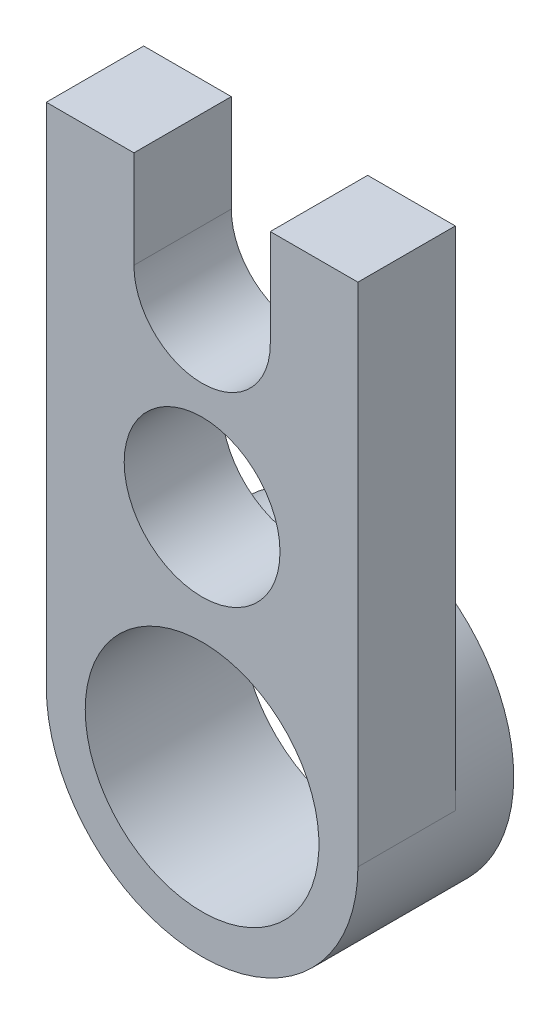
ISO-10303-21;
HEADER;
FILE_DESCRIPTION(('STEP AP214'),'2;1');
FILE_NAME('part.step','',(''),(''),'','','');
FILE_SCHEMA(('AUTOMOTIVE_DESIGN { 1 0 10303 214 1 1 1 1 }'));
ENDSEC;
DATA;
#1=APPLICATION_CONTEXT('core data for automotive mechanical design processes');
#2=APPLICATION_PROTOCOL_DEFINITION('international standard','automotive_design',2000,#1);
#3=PRODUCT_CONTEXT('',#1,'mechanical');
#4=PRODUCT('Part','Part','',(#3));
#5=PRODUCT_RELATED_PRODUCT_CATEGORY('part','',(#4));
#6=PRODUCT_DEFINITION_FORMATION('','',#4);
#7=PRODUCT_DEFINITION_CONTEXT('part definition',#1,'design');
#8=PRODUCT_DEFINITION('design','',#6,#7);
#9=PRODUCT_DEFINITION_SHAPE('','',#8);
#10=(LENGTH_UNIT() NAMED_UNIT(*) SI_UNIT(.MILLI.,.METRE.));
#11=(NAMED_UNIT(*) PLANE_ANGLE_UNIT() SI_UNIT($,.RADIAN.));
#12=(NAMED_UNIT(*) SI_UNIT($,.STERADIAN.) SOLID_ANGLE_UNIT());
#13=UNCERTAINTY_MEASURE_WITH_UNIT(LENGTH_MEASURE(1.E-05),#10,'distance_accuracy_value','');
#14=(GEOMETRIC_REPRESENTATION_CONTEXT(3) GLOBAL_UNCERTAINTY_ASSIGNED_CONTEXT((#13)) GLOBAL_UNIT_ASSIGNED_CONTEXT((#10,
#11,#12)) REPRESENTATION_CONTEXT('',''));
#15=CARTESIAN_POINT('',(0.,0.,0.));
#16=DIRECTION('',(0.,0.,1.));
#17=DIRECTION('',(1.,0.,0.));
#18=AXIS2_PLACEMENT_3D('',#15,#16,#17);
#19=CARTESIAN_POINT('',(-22.2428015564203,0.,-3.));
#20=DIRECTION('',(0.,0.,1.));
#21=DIRECTION('',(1.,0.,0.));
#22=AXIS2_PLACEMENT_3D('',#19,#20,#21);
#23=PLANE('',#22);
#24=CARTESIAN_POINT('',(-22.2428015564203,0.,-3.));
#25=DIRECTION('',(0.,0.,1.));
#26=DIRECTION('',(1.,0.,0.));
#27=AXIS2_PLACEMENT_3D('',#24,#25,#26);
#28=CIRCLE('',#27,7.99999999999999);
#29=CARTESIAN_POINT('',(-14.2428015564203,0.,-3.));
#30=VERTEX_POINT('',#29);
#31=EDGE_CURVE('E121',#30,#30,#28,.T.);
#32=ORIENTED_EDGE('',*,*,#31,.F.);
#33=EDGE_LOOP('',(#32));
#34=FACE_BOUND('',#33,.T.);
#35=CARTESIAN_POINT('',(-22.2428015564203,0.,-3.));
#36=DIRECTION('',(0.,0.,-1.));
#37=DIRECTION('',(-1.,0.,0.));
#38=AXIS2_PLACEMENT_3D('',#35,#36,#37);
#39=CIRCLE('',#38,6.);
#40=CARTESIAN_POINT('',(-28.2428015564203,0.,-3.));
#41=VERTEX_POINT('',#40);
#42=EDGE_CURVE('E310',#41,#41,#39,.T.);
#43=ORIENTED_EDGE('',*,*,#42,.F.);
#44=EDGE_LOOP('',(#43));
#45=FACE_BOUND('',#44,.T.);
#46=ADVANCED_FACE('F30',(#34,#45),#23,.F.);
#47=CARTESIAN_POINT('',(-22.2428015564203,0.,5.));
#48=DIRECTION('',(0.,0.,-1.));
#49=DIRECTION('',(-1.,0.,0.));
#50=AXIS2_PLACEMENT_3D('',#47,#48,#49);
#51=PLANE('',#50);
#52=DIRECTION('',(0.,1.,0.));
#53=VECTOR('',#52,1.);
#54=CARTESIAN_POINT('',(-30.2428015564203,0.,5.));
#55=LINE('',#54,#53);
#56=CARTESIAN_POINT('',(-30.2428015564203,0.,5.));
#57=VERTEX_POINT('',#56);
#58=CARTESIAN_POINT('',(-30.2428015564203,26.,5.));
#59=VERTEX_POINT('',#58);
#60=EDGE_CURVE('E142',#57,#59,#55,.T.);
#61=ORIENTED_EDGE('',*,*,#60,.F.);
#62=CARTESIAN_POINT('',(-22.2428015564203,0.,5.));
#63=DIRECTION('',(0.,0.,-1.));
#64=DIRECTION('',(-1.,0.,0.));
#65=AXIS2_PLACEMENT_3D('',#62,#63,#64);
#66=CIRCLE('',#65,7.99999999999999);
#67=CARTESIAN_POINT('',(-14.2428015564203,0.,5.));
#68=VERTEX_POINT('',#67);
#69=EDGE_CURVE('E114',#68,#57,#66,.T.);
#70=ORIENTED_EDGE('',*,*,#69,.F.);
#71=DIRECTION('',(0.,-1.,0.));
#72=VECTOR('',#71,1.);
#73=CARTESIAN_POINT('',(-14.2428015564203,26.,5.));
#74=LINE('',#73,#72);
#75=CARTESIAN_POINT('',(-14.2428015564203,26.,5.));
#76=VERTEX_POINT('',#75);
#77=EDGE_CURVE('E115',#76,#68,#74,.T.);
#78=ORIENTED_EDGE('',*,*,#77,.F.);
#79=DIRECTION('',(-1.,0.,0.));
#80=VECTOR('',#79,1.);
#81=CARTESIAN_POINT('',(-14.2428015564203,26.,5.));
#82=LINE('',#81,#80);
#83=CARTESIAN_POINT('',(-18.7428015564203,26.,5.));
#84=VERTEX_POINT('',#83);
#85=EDGE_CURVE('E154',#76,#84,#82,.T.);
#86=ORIENTED_EDGE('',*,*,#85,.T.);
#87=DIRECTION('',(0.,1.,0.));
#88=VECTOR('',#87,1.);
#89=CARTESIAN_POINT('',(-18.7428015564203,21.,5.));
#90=LINE('',#89,#88);
#91=CARTESIAN_POINT('',(-18.7428015564203,21.,5.));
#92=VERTEX_POINT('',#91);
#93=EDGE_CURVE('E151',#92,#84,#90,.T.);
#94=ORIENTED_EDGE('',*,*,#93,.F.);
#95=CARTESIAN_POINT('',(-22.2428015564203,21.,5.));
#96=DIRECTION('',(0.,0.,1.));
#97=DIRECTION('',(1.,0.,0.));
#98=AXIS2_PLACEMENT_3D('',#95,#96,#97);
#99=CIRCLE('',#98,3.5);
#100=CARTESIAN_POINT('',(-25.7428015564203,21.,5.));
#101=VERTEX_POINT('',#100);
#102=EDGE_CURVE('E148',#101,#92,#99,.T.);
#103=ORIENTED_EDGE('',*,*,#102,.F.);
#104=DIRECTION('',(0.,1.,0.));
#105=VECTOR('',#104,1.);
#106=CARTESIAN_POINT('',(-25.7428015564203,21.,5.));
#107=LINE('',#106,#105);
#108=CARTESIAN_POINT('',(-25.7428015564203,26.,5.));
#109=VERTEX_POINT('',#108);
#110=EDGE_CURVE('E146',#101,#109,#107,.T.);
#111=ORIENTED_EDGE('',*,*,#110,.T.);
#112=DIRECTION('',(-1.,0.,0.));
#113=VECTOR('',#112,1.);
#114=CARTESIAN_POINT('',(-25.7428015564203,26.,5.));
#115=LINE('',#114,#113);
#116=EDGE_CURVE('E144',#109,#59,#115,.T.);
#117=ORIENTED_EDGE('',*,*,#116,.T.);
#118=EDGE_LOOP('',(#61,#70,#78,#86,#94,#103,#111,#117));
#119=FACE_BOUND('',#118,.T.);
#120=CARTESIAN_POINT('',(-22.2428015564203,12.,5.));
#121=DIRECTION('',(0.,0.,1.));
#122=DIRECTION('',(1.,0.,0.));
#123=AXIS2_PLACEMENT_3D('',#120,#121,#122);
#124=CIRCLE('',#123,4.);
#125=CARTESIAN_POINT('',(-18.2428015564203,12.,5.));
#126=VERTEX_POINT('',#125);
#127=EDGE_CURVE('E109',#126,#126,#124,.T.);
#128=ORIENTED_EDGE('',*,*,#127,.F.);
#129=EDGE_LOOP('',(#128));
#130=FACE_BOUND('',#129,.T.);
#131=CARTESIAN_POINT('',(-22.2428015564203,0.,5.00000000000001));
#132=DIRECTION('',(0.,0.,-1.));
#133=DIRECTION('',(-1.,0.,0.));
#134=AXIS2_PLACEMENT_3D('',#131,#132,#133);
#135=CIRCLE('',#134,6.);
#136=CARTESIAN_POINT('',(-28.2428015564203,0.,5.00000000000001));
#137=VERTEX_POINT('',#136);
#138=EDGE_CURVE('E313',#137,#137,#135,.T.);
#139=ORIENTED_EDGE('',*,*,#138,.T.);
#140=EDGE_LOOP('',(#139));
#141=FACE_BOUND('',#140,.T.);
#142=ADVANCED_FACE('F191',(#119,#130,#141),#51,.F.);
#143=CARTESIAN_POINT('',(-22.2428015564203,0.,0.));
#144=DIRECTION('',(0.,0.,-1.));
#145=DIRECTION('',(-1.,0.,0.));
#146=AXIS2_PLACEMENT_3D('',#143,#144,#145);
#147=PLANE('',#146);
#148=CARTESIAN_POINT('',(-22.2428015564203,0.,0.));
#149=DIRECTION('',(0.,0.,-1.));
#150=DIRECTION('',(-1.,0.,0.));
#151=AXIS2_PLACEMENT_3D('',#148,#149,#150);
#152=CIRCLE('',#151,7.99999999999999);
#153=CARTESIAN_POINT('',(-30.2428015564203,0.,0.));
#154=VERTEX_POINT('',#153);
#155=CARTESIAN_POINT('',(-22.2428015564203,8.,0.));
#156=VERTEX_POINT('',#155);
#157=EDGE_CURVE('E113',#154,#156,#152,.T.);
#158=ORIENTED_EDGE('',*,*,#157,.F.);
#159=DIRECTION('',(0.,1.,0.));
#160=VECTOR('',#159,1.);
#161=CARTESIAN_POINT('',(-30.2428015564203,0.,0.));
#162=LINE('',#161,#160);
#163=CARTESIAN_POINT('',(-30.2428015564203,26.,0.));
#164=VERTEX_POINT('',#163);
#165=EDGE_CURVE('E98',#154,#164,#162,.T.);
#166=ORIENTED_EDGE('',*,*,#165,.T.);
#167=DIRECTION('',(-1.,0.,0.));
#168=VECTOR('',#167,1.);
#169=CARTESIAN_POINT('',(-25.7428015564203,26.,0.));
#170=LINE('',#169,#168);
#171=CARTESIAN_POINT('',(-25.7428015564203,26.,0.));
#172=VERTEX_POINT('',#171);
#173=EDGE_CURVE('E108',#172,#164,#170,.T.);
#174=ORIENTED_EDGE('',*,*,#173,.F.);
#175=DIRECTION('',(0.,1.,0.));
#176=VECTOR('',#175,1.);
#177=CARTESIAN_POINT('',(-25.7428015564203,21.,0.));
#178=LINE('',#177,#176);
#179=CARTESIAN_POINT('',(-25.7428015564203,21.,0.));
#180=VERTEX_POINT('',#179);
#181=EDGE_CURVE('E128',#180,#172,#178,.T.);
#182=ORIENTED_EDGE('',*,*,#181,.F.);
#183=CARTESIAN_POINT('',(-22.2428015564203,21.,0.));
#184=DIRECTION('',(0.,0.,1.));
#185=DIRECTION('',(1.,0.,0.));
#186=AXIS2_PLACEMENT_3D('',#183,#184,#185);
#187=CIRCLE('',#186,3.5);
#188=CARTESIAN_POINT('',(-18.7428015564203,21.,0.));
#189=VERTEX_POINT('',#188);
#190=EDGE_CURVE('E130',#180,#189,#187,.T.);
#191=ORIENTED_EDGE('',*,*,#190,.T.);
#192=DIRECTION('',(0.,1.,0.));
#193=VECTOR('',#192,1.);
#194=CARTESIAN_POINT('',(-18.7428015564203,21.,0.));
#195=LINE('',#194,#193);
#196=CARTESIAN_POINT('',(-18.7428015564203,26.,0.));
#197=VERTEX_POINT('',#196);
#198=EDGE_CURVE('E133',#189,#197,#195,.T.);
#199=ORIENTED_EDGE('',*,*,#198,.T.);
#200=DIRECTION('',(-1.,0.,0.));
#201=VECTOR('',#200,1.);
#202=CARTESIAN_POINT('',(-14.2428015564203,26.,0.));
#203=LINE('',#202,#201);
#204=CARTESIAN_POINT('',(-14.2428015564203,26.,0.));
#205=VERTEX_POINT('',#204);
#206=EDGE_CURVE('E136',#205,#197,#203,.T.);
#207=ORIENTED_EDGE('',*,*,#206,.F.);
#208=DIRECTION('',(0.,-1.,0.));
#209=VECTOR('',#208,1.);
#210=CARTESIAN_POINT('',(-14.2428015564203,26.,0.));
#211=LINE('',#210,#209);
#212=CARTESIAN_POINT('',(-14.2428015564203,0.,0.));
#213=VERTEX_POINT('',#212);
#214=EDGE_CURVE('E139',#205,#213,#211,.T.);
#215=ORIENTED_EDGE('',*,*,#214,.T.);
#216=EDGE_CURVE('E47',#156,#213,#152,.T.);
#217=ORIENTED_EDGE('',*,*,#216,.F.);
#218=CARTESIAN_POINT('',(-22.2428015564203,12.,0.));
#219=DIRECTION('',(0.,0.,1.));
#220=DIRECTION('',(1.,0.,0.));
#221=AXIS2_PLACEMENT_3D('',#218,#219,#220);
#222=CIRCLE('',#221,4.);
#223=EDGE_CURVE('E118',#156,#156,#222,.T.);
#224=ORIENTED_EDGE('',*,*,#223,.T.);
#225=EDGE_LOOP('',(#158,#166,#174,#182,#191,#199,#207,#215,#217,#224));
#226=FACE_BOUND('',#225,.T.);
#227=ADVANCED_FACE('F116',(#226),#147,.T.);
#228=CARTESIAN_POINT('',(-22.2428015564203,0.,5.));
#229=DIRECTION('',(0.,0.,-1.));
#230=DIRECTION('',(-1.,0.,0.));
#231=AXIS2_PLACEMENT_3D('',#228,#229,#230);
#232=CYLINDRICAL_SURFACE('',#231,7.99999999999999);
#233=DIRECTION('',(0.,0.,-1.));
#234=VECTOR('',#233,1.);
#235=CARTESIAN_POINT('',(-30.2428015564203,0.,5.));
#236=LINE('',#235,#234);
#237=EDGE_CURVE('E34',#57,#154,#236,.T.);
#238=ORIENTED_EDGE('',*,*,#237,.T.);
#239=ORIENTED_EDGE('',*,*,#157,.T.);
#240=ORIENTED_EDGE('',*,*,#216,.T.);
#241=DIRECTION('',(0.,0.,-1.));
#242=VECTOR('',#241,1.);
#243=CARTESIAN_POINT('',(-14.2428015564203,0.,5.));
#244=LINE('',#243,#242);
#245=EDGE_CURVE('E11',#68,#213,#244,.T.);
#246=ORIENTED_EDGE('',*,*,#245,.F.);
#247=ORIENTED_EDGE('',*,*,#69,.T.);
#248=EDGE_LOOP('',(#238,#239,#240,#246,#247));
#249=FACE_BOUND('',#248,.T.);
#250=ORIENTED_EDGE('',*,*,#31,.T.);
#251=EDGE_LOOP('',(#250));
#252=FACE_BOUND('',#251,.T.);
#253=ADVANCED_FACE('F32',(#249,#252),#232,.T.);
#254=CARTESIAN_POINT('',(-14.2428015564203,26.,5.));
#255=DIRECTION('',(1.,0.,0.));
#256=DIRECTION('',(0.,1.,0.));
#257=AXIS2_PLACEMENT_3D('',#254,#255,#256);
#258=PLANE('',#257);
#259=ORIENTED_EDGE('',*,*,#214,.F.);
#260=DIRECTION('',(0.,0.,-1.));
#261=VECTOR('',#260,1.);
#262=CARTESIAN_POINT('',(-14.2428015564203,26.,5.));
#263=LINE('',#262,#261);
#264=EDGE_CURVE('E39',#76,#205,#263,.T.);
#265=ORIENTED_EDGE('',*,*,#264,.F.);
#266=ORIENTED_EDGE('',*,*,#77,.T.);
#267=ORIENTED_EDGE('',*,*,#245,.T.);
#268=EDGE_LOOP('',(#259,#265,#266,#267));
#269=FACE_BOUND('',#268,.T.);
#270=ADVANCED_FACE('F187',(#269),#258,.T.);
#271=CARTESIAN_POINT('',(-14.2428015564203,26.,5.));
#272=DIRECTION('',(0.,-1.,0.));
#273=DIRECTION('',(1.,0.,0.));
#274=AXIS2_PLACEMENT_3D('',#271,#272,#273);
#275=PLANE('',#274);
#276=ORIENTED_EDGE('',*,*,#206,.T.);
#277=DIRECTION('',(0.,0.,-1.));
#278=VECTOR('',#277,1.);
#279=CARTESIAN_POINT('',(-18.7428015564203,26.,5.));
#280=LINE('',#279,#278);
#281=EDGE_CURVE('E159',#84,#197,#280,.T.);
#282=ORIENTED_EDGE('',*,*,#281,.F.);
#283=ORIENTED_EDGE('',*,*,#85,.F.);
#284=ORIENTED_EDGE('',*,*,#264,.T.);
#285=EDGE_LOOP('',(#276,#282,#283,#284));
#286=FACE_BOUND('',#285,.T.);
#287=ADVANCED_FACE('F222',(#286),#275,.F.);
#288=CARTESIAN_POINT('',(-18.7428015564203,21.,5.));
#289=DIRECTION('',(-1.,0.,0.));
#290=DIRECTION('',(0.,-1.,0.));
#291=AXIS2_PLACEMENT_3D('',#288,#289,#290);
#292=PLANE('',#291);
#293=ORIENTED_EDGE('',*,*,#198,.F.);
#294=DIRECTION('',(0.,0.,-1.));
#295=VECTOR('',#294,1.);
#296=CARTESIAN_POINT('',(-18.7428015564203,21.,5.));
#297=LINE('',#296,#295);
#298=EDGE_CURVE('E161',#92,#189,#297,.T.);
#299=ORIENTED_EDGE('',*,*,#298,.F.);
#300=ORIENTED_EDGE('',*,*,#93,.T.);
#301=ORIENTED_EDGE('',*,*,#281,.T.);
#302=EDGE_LOOP('',(#293,#299,#300,#301));
#303=FACE_BOUND('',#302,.T.);
#304=ADVANCED_FACE('F181',(#303),#292,.T.);
#305=CARTESIAN_POINT('',(-22.2428015564203,21.,5.));
#306=DIRECTION('',(0.,0.,-1.));
#307=DIRECTION('',(-1.,0.,0.));
#308=AXIS2_PLACEMENT_3D('',#305,#306,#307);
#309=CYLINDRICAL_SURFACE('',#308,3.5);
#310=ORIENTED_EDGE('',*,*,#190,.F.);
#311=DIRECTION('',(0.,0.,-1.));
#312=VECTOR('',#311,1.);
#313=CARTESIAN_POINT('',(-25.7428015564203,21.,5.));
#314=LINE('',#313,#312);
#315=EDGE_CURVE('E163',#101,#180,#314,.T.);
#316=ORIENTED_EDGE('',*,*,#315,.F.);
#317=ORIENTED_EDGE('',*,*,#102,.T.);
#318=ORIENTED_EDGE('',*,*,#298,.T.);
#319=EDGE_LOOP('',(#310,#316,#317,#318));
#320=FACE_BOUND('',#319,.T.);
#321=ADVANCED_FACE('F176',(#320),#309,.F.);
#322=CARTESIAN_POINT('',(-25.7428015564203,21.,5.));
#323=DIRECTION('',(-1.,0.,0.));
#324=DIRECTION('',(0.,-1.,0.));
#325=AXIS2_PLACEMENT_3D('',#322,#323,#324);
#326=PLANE('',#325);
#327=ORIENTED_EDGE('',*,*,#181,.T.);
#328=DIRECTION('',(0.,0.,-1.));
#329=VECTOR('',#328,1.);
#330=CARTESIAN_POINT('',(-25.7428015564203,26.,5.));
#331=LINE('',#330,#329);
#332=EDGE_CURVE('E165',#109,#172,#331,.T.);
#333=ORIENTED_EDGE('',*,*,#332,.F.);
#334=ORIENTED_EDGE('',*,*,#110,.F.);
#335=ORIENTED_EDGE('',*,*,#315,.T.);
#336=EDGE_LOOP('',(#327,#333,#334,#335));
#337=FACE_BOUND('',#336,.T.);
#338=ADVANCED_FACE('F193',(#337),#326,.F.);
#339=CARTESIAN_POINT('',(-25.7428015564203,26.,5.));
#340=DIRECTION('',(0.,-1.,0.));
#341=DIRECTION('',(1.,0.,0.));
#342=AXIS2_PLACEMENT_3D('',#339,#340,#341);
#343=PLANE('',#342);
#344=ORIENTED_EDGE('',*,*,#173,.T.);
#345=DIRECTION('',(0.,0.,-1.));
#346=VECTOR('',#345,1.);
#347=CARTESIAN_POINT('',(-30.2428015564203,26.,5.));
#348=LINE('',#347,#346);
#349=EDGE_CURVE('E104',#59,#164,#348,.T.);
#350=ORIENTED_EDGE('',*,*,#349,.F.);
#351=ORIENTED_EDGE('',*,*,#116,.F.);
#352=ORIENTED_EDGE('',*,*,#332,.T.);
#353=EDGE_LOOP('',(#344,#350,#351,#352));
#354=FACE_BOUND('',#353,.T.);
#355=ADVANCED_FACE('F170',(#354),#343,.F.);
#356=CARTESIAN_POINT('',(-30.2428015564203,0.,5.));
#357=DIRECTION('',(-1.,0.,0.));
#358=DIRECTION('',(0.,-1.,0.));
#359=AXIS2_PLACEMENT_3D('',#356,#357,#358);
#360=PLANE('',#359);
#361=ORIENTED_EDGE('',*,*,#165,.F.);
#362=ORIENTED_EDGE('',*,*,#237,.F.);
#363=ORIENTED_EDGE('',*,*,#60,.T.);
#364=ORIENTED_EDGE('',*,*,#349,.T.);
#365=EDGE_LOOP('',(#361,#362,#363,#364));
#366=FACE_BOUND('',#365,.T.);
#367=ADVANCED_FACE('F100',(#366),#360,.T.);
#368=CARTESIAN_POINT('',(-22.2428015564203,12.,5.));
#369=DIRECTION('',(0.,0.,-1.));
#370=DIRECTION('',(-1.,0.,0.));
#371=AXIS2_PLACEMENT_3D('',#368,#369,#370);
#372=CYLINDRICAL_SURFACE('',#371,4.);
#373=ORIENTED_EDGE('',*,*,#127,.T.);
#374=EDGE_LOOP('',(#373));
#375=FACE_BOUND('',#374,.T.);
#376=ORIENTED_EDGE('',*,*,#223,.F.);
#377=EDGE_LOOP('',(#376));
#378=FACE_BOUND('',#377,.T.);
#379=ADVANCED_FACE('F214',(#375,#378),#372,.F.);
#380=CARTESIAN_POINT('',(-22.2428015564203,0.,-3.));
#381=DIRECTION('',(0.,0.,-1.));
#382=DIRECTION('',(-1.,0.,0.));
#383=AXIS2_PLACEMENT_3D('',#380,#381,#382);
#384=CYLINDRICAL_SURFACE('',#383,6.);
#385=ORIENTED_EDGE('',*,*,#42,.T.);
#386=EDGE_LOOP('',(#385));
#387=FACE_BOUND('',#386,.T.);
#388=ORIENTED_EDGE('',*,*,#138,.F.);
#389=EDGE_LOOP('',(#388));
#390=FACE_BOUND('',#389,.T.);
#391=ADVANCED_FACE('F213',(#387,#390),#384,.F.);
#392=CLOSED_SHELL('',(#46,#142,#227,#253,#270,#287,#304,#321,#338,#355,#367,#379,#391));
#393=MANIFOLD_SOLID_BREP('B2',#392);
#394=ADVANCED_BREP_SHAPE_REPRESENTATION('',(#18,#393),#14);
#395=SHAPE_DEFINITION_REPRESENTATION(#9,#394);
ENDSEC;
END-ISO-10303-21;
